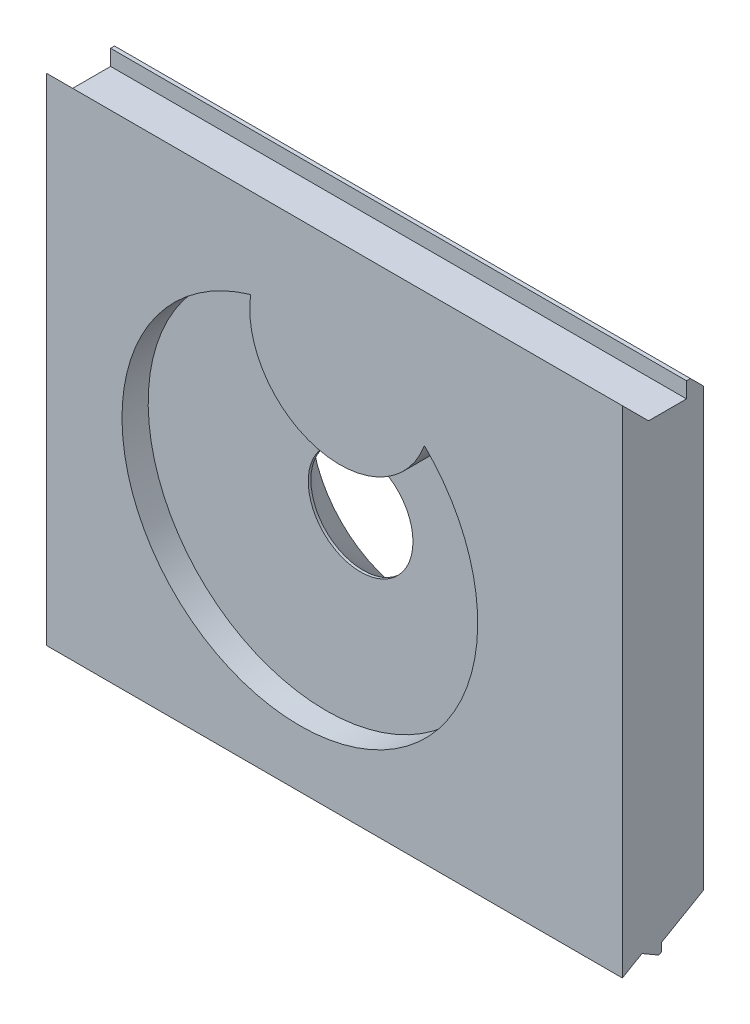
ISO-10303-21;
HEADER;
FILE_DESCRIPTION(('STEP AP214'),'2;1');
FILE_NAME('part.step','',(''),(''),'','','');
FILE_SCHEMA(('AUTOMOTIVE_DESIGN { 1 0 10303 214 1 1 1 1 }'));
ENDSEC;
DATA;
#1=APPLICATION_CONTEXT('core data for automotive mechanical design processes');
#2=APPLICATION_PROTOCOL_DEFINITION('international standard','automotive_design',2000,#1);
#3=PRODUCT_CONTEXT('',#1,'mechanical');
#4=PRODUCT('Part','Part','',(#3));
#5=PRODUCT_RELATED_PRODUCT_CATEGORY('part','',(#4));
#6=PRODUCT_DEFINITION_FORMATION('','',#4);
#7=PRODUCT_DEFINITION_CONTEXT('part definition',#1,'design');
#8=PRODUCT_DEFINITION('design','',#6,#7);
#9=PRODUCT_DEFINITION_SHAPE('','',#8);
#10=(LENGTH_UNIT() NAMED_UNIT(*) SI_UNIT(.MILLI.,.METRE.));
#11=(NAMED_UNIT(*) PLANE_ANGLE_UNIT() SI_UNIT($,.RADIAN.));
#12=(NAMED_UNIT(*) SI_UNIT($,.STERADIAN.) SOLID_ANGLE_UNIT());
#13=UNCERTAINTY_MEASURE_WITH_UNIT(LENGTH_MEASURE(1.E-05),#10,'distance_accuracy_value','');
#14=(GEOMETRIC_REPRESENTATION_CONTEXT(3) GLOBAL_UNCERTAINTY_ASSIGNED_CONTEXT((#13)) GLOBAL_UNIT_ASSIGNED_CONTEXT((#10,
#11,#12)) REPRESENTATION_CONTEXT('',''));
#15=CARTESIAN_POINT('',(0.,0.,0.));
#16=DIRECTION('',(0.,0.,1.));
#17=DIRECTION('',(1.,0.,0.));
#18=AXIS2_PLACEMENT_3D('',#15,#16,#17);
#19=CARTESIAN_POINT('',(22.,-18.3660254037844,0.));
#20=DIRECTION('',(0.,0.,1.));
#21=DIRECTION('',(0.,-1.,0.));
#22=AXIS2_PLACEMENT_3D('',#19,#20,#21);
#23=PLANE('',#22);
#24=DIRECTION('',(0.,1.,0.));
#25=VECTOR('',#24,1.);
#26=CARTESIAN_POINT('',(-22.,-18.3660254037844,0.));
#27=LINE('',#26,#25);
#28=CARTESIAN_POINT('',(-22.,-18.3660254037844,0.));
#29=VERTEX_POINT('',#28);
#30=CARTESIAN_POINT('',(-22.,19.5,0.));
#31=VERTEX_POINT('',#30);
#32=EDGE_CURVE('E247',#29,#31,#27,.T.);
#33=ORIENTED_EDGE('',*,*,#32,.F.);
#34=DIRECTION('',(-1.,0.,0.));
#35=VECTOR('',#34,1.);
#36=CARTESIAN_POINT('',(22.,-18.3660254037844,0.));
#37=LINE('',#36,#35);
#38=CARTESIAN_POINT('',(22.,-18.3660254037844,0.));
#39=VERTEX_POINT('',#38);
#40=EDGE_CURVE('E283',#39,#29,#37,.T.);
#41=ORIENTED_EDGE('',*,*,#40,.F.);
#42=DIRECTION('',(0.,-1.,0.));
#43=VECTOR('',#42,1.);
#44=CARTESIAN_POINT('',(22.,19.5,0.));
#45=LINE('',#44,#43);
#46=CARTESIAN_POINT('',(22.,19.5,0.));
#47=VERTEX_POINT('',#46);
#48=EDGE_CURVE('E219',#47,#39,#45,.T.);
#49=ORIENTED_EDGE('',*,*,#48,.F.);
#50=DIRECTION('',(-1.,0.,0.));
#51=VECTOR('',#50,1.);
#52=CARTESIAN_POINT('',(22.,19.5,0.));
#53=LINE('',#52,#51);
#54=EDGE_CURVE('E285',#47,#31,#53,.T.);
#55=ORIENTED_EDGE('',*,*,#54,.T.);
#56=EDGE_LOOP('',(#33,#41,#49,#55));
#57=FACE_BOUND('',#56,.T.);
#58=CARTESIAN_POINT('',(-2.64088104605542,-0.405297192010157,0.));
#59=DIRECTION('',(0.,0.,1.));
#60=DIRECTION('',(1.,0.,0.));
#61=AXIS2_PLACEMENT_3D('',#58,#59,#60);
#62=CIRCLE('',#61,13.5882922466304);
#63=CARTESIAN_POINT('',(-6.40316383933737,12.651766580646,0.));
#64=VERTEX_POINT('',#63);
#65=CARTESIAN_POINT('',(6.87547395210686,9.29422206044705,0.));
#66=VERTEX_POINT('',#65);
#67=EDGE_CURVE('E50',#64,#66,#62,.T.);
#68=ORIENTED_EDGE('',*,*,#67,.F.);
#69=CARTESIAN_POINT('',(0.417594285720029,11.6905621124277,0.));
#70=DIRECTION('',(0.,0.,-1.));
#71=DIRECTION('',(-1.,0.,0.));
#72=AXIS2_PLACEMENT_3D('',#69,#70,#71);
#73=CIRCLE('',#72,6.88815326704185);
#74=EDGE_CURVE('E172',#66,#64,#73,.T.);
#75=ORIENTED_EDGE('',*,*,#74,.F.);
#76=EDGE_LOOP('',(#68,#75));
#77=FACE_BOUND('',#76,.T.);
#78=ADVANCED_FACE('F34',(#57,#77),#23,.T.);
#79=CARTESIAN_POINT('',(0.,0.5,-6.2));
#80=DIRECTION('',(0.,0.,1.));
#81=DIRECTION('',(1.,0.,0.));
#82=AXIS2_PLACEMENT_3D('',#79,#80,#81);
#83=CYLINDRICAL_SURFACE('',#82,4.);
#84=CARTESIAN_POINT('',(0.,0.5,-2.19999999999999));
#85=DIRECTION('',(0.,0.,-1.));
#86=DIRECTION('',(-1.,0.,0.));
#87=AXIS2_PLACEMENT_3D('',#84,#85,#86);
#88=CIRCLE('',#87,4.);
#89=CARTESIAN_POINT('',(-4.,0.5,-2.19999999999999));
#90=VERTEX_POINT('',#89);
#91=EDGE_CURVE('E301',#90,#90,#88,.T.);
#92=ORIENTED_EDGE('',*,*,#91,.T.);
#93=EDGE_LOOP('',(#92));
#94=FACE_BOUND('',#93,.T.);
#95=CARTESIAN_POINT('',(0.,0.5,-2.));
#96=DIRECTION('',(0.,0.,1.));
#97=DIRECTION('',(1.,0.,0.));
#98=AXIS2_PLACEMENT_3D('',#95,#96,#97);
#99=CIRCLE('',#98,4.);
#100=CARTESIAN_POINT('',(4.,0.5,-2.));
#101=VERTEX_POINT('',#100);
#102=EDGE_CURVE('E38',#101,#101,#99,.F.);
#103=ORIENTED_EDGE('',*,*,#102,.F.);
#104=EDGE_LOOP('',(#103));
#105=FACE_BOUND('',#104,.T.);
#106=ADVANCED_FACE('F337',(#94,#105),#83,.F.);
#107=CARTESIAN_POINT('',(22.,17.5,-2.));
#108=DIRECTION('',(0.,-0.707106781186551,0.707106781186544));
#109=DIRECTION('',(0.,-0.707106781186544,-0.707106781186551));
#110=AXIS2_PLACEMENT_3D('',#107,#108,#109);
#111=PLANE('',#110);
#112=DIRECTION('',(0.,0.707106781186544,0.707106781186551));
#113=VECTOR('',#112,1.);
#114=CARTESIAN_POINT('',(-22.,17.5,-2.));
#115=LINE('',#114,#113);
#116=CARTESIAN_POINT('',(-22.,17.5,-2.));
#117=VERTEX_POINT('',#116);
#118=EDGE_CURVE('E215',#117,#31,#115,.T.);
#119=ORIENTED_EDGE('',*,*,#118,.T.);
#120=ORIENTED_EDGE('',*,*,#54,.F.);
#121=DIRECTION('',(0.,0.707106781186544,0.707106781186551));
#122=VECTOR('',#121,1.);
#123=CARTESIAN_POINT('',(22.,17.5,-2.));
#124=LINE('',#123,#122);
#125=CARTESIAN_POINT('',(22.,17.5,-2.));
#126=VERTEX_POINT('',#125);
#127=EDGE_CURVE('E216',#126,#47,#124,.T.);
#128=ORIENTED_EDGE('',*,*,#127,.F.);
#129=DIRECTION('',(-1.,0.,0.));
#130=VECTOR('',#129,1.);
#131=CARTESIAN_POINT('',(22.,17.5,-2.));
#132=LINE('',#131,#130);
#133=EDGE_CURVE('E244',#126,#117,#132,.T.);
#134=ORIENTED_EDGE('',*,*,#133,.T.);
#135=EDGE_LOOP('',(#119,#120,#128,#134));
#136=FACE_BOUND('',#135,.T.);
#137=ADVANCED_FACE('F340',(#136),#111,.F.);
#138=CARTESIAN_POINT('',(22.,-17.5,-1.5));
#139=DIRECTION('',(0.,-0.866025403784439,-0.5));
#140=DIRECTION('',(0.,0.5,-0.866025403784439));
#141=AXIS2_PLACEMENT_3D('',#138,#139,#140);
#142=PLANE('',#141);
#143=DIRECTION('',(0.,-0.5,0.866025403784438));
#144=VECTOR('',#143,1.);
#145=CARTESIAN_POINT('',(-22.,-17.5,-1.5));
#146=LINE('',#145,#144);
#147=CARTESIAN_POINT('',(-22.,-17.5,-1.5));
#148=VERTEX_POINT('',#147);
#149=EDGE_CURVE('E249',#148,#29,#146,.T.);
#150=ORIENTED_EDGE('',*,*,#149,.F.);
#151=DIRECTION('',(-1.,0.,0.));
#152=VECTOR('',#151,1.);
#153=CARTESIAN_POINT('',(22.,-17.5,-1.5));
#154=LINE('',#153,#152);
#155=CARTESIAN_POINT('',(22.,-17.5,-1.5));
#156=VERTEX_POINT('',#155);
#157=EDGE_CURVE('E280',#156,#148,#154,.T.);
#158=ORIENTED_EDGE('',*,*,#157,.F.);
#159=DIRECTION('',(0.,-0.5,0.866025403784438));
#160=VECTOR('',#159,1.);
#161=CARTESIAN_POINT('',(22.,-17.5,-1.5));
#162=LINE('',#161,#160);
#163=EDGE_CURVE('E222',#156,#39,#162,.T.);
#164=ORIENTED_EDGE('',*,*,#163,.T.);
#165=ORIENTED_EDGE('',*,*,#40,.T.);
#166=EDGE_LOOP('',(#150,#158,#164,#165));
#167=FACE_BOUND('',#166,.T.);
#168=ADVANCED_FACE('F378',(#167),#142,.T.);
#169=CARTESIAN_POINT('',(22.,-18.3660254037844,-3.));
#170=DIRECTION('',(0.,-0.866025403784438,0.5));
#171=DIRECTION('',(0.,-0.5,-0.866025403784439));
#172=AXIS2_PLACEMENT_3D('',#169,#170,#171);
#173=PLANE('',#172);
#174=DIRECTION('',(0.,0.5,0.866025403784439));
#175=VECTOR('',#174,1.);
#176=CARTESIAN_POINT('',(-22.,-18.3660254037844,-3.));
#177=LINE('',#176,#175);
#178=CARTESIAN_POINT('',(-22.,-18.1928203230276,-2.7));
#179=VERTEX_POINT('',#178);
#180=EDGE_CURVE('E252',#179,#148,#177,.T.);
#181=ORIENTED_EDGE('',*,*,#180,.F.);
#182=DIRECTION('',(-1.,0.,0.));
#183=VECTOR('',#182,1.);
#184=CARTESIAN_POINT('',(22.,-18.1928203230276,-2.7));
#185=LINE('',#184,#183);
#186=CARTESIAN_POINT('',(22.,-18.1928203230276,-2.7));
#187=VERTEX_POINT('',#186);
#188=EDGE_CURVE('E43',#179,#187,#185,.F.);
#189=ORIENTED_EDGE('',*,*,#188,.T.);
#190=DIRECTION('',(0.,0.5,0.866025403784439));
#191=VECTOR('',#190,1.);
#192=CARTESIAN_POINT('',(22.,-18.3660254037844,-3.));
#193=LINE('',#192,#191);
#194=EDGE_CURVE('E225',#187,#156,#193,.T.);
#195=ORIENTED_EDGE('',*,*,#194,.T.);
#196=ORIENTED_EDGE('',*,*,#157,.T.);
#197=EDGE_LOOP('',(#181,#189,#195,#196));
#198=FACE_BOUND('',#197,.T.);
#199=ADVANCED_FACE('F374',(#198),#173,.T.);
#200=CARTESIAN_POINT('',(22.,-17.5,-3.));
#201=DIRECTION('',(0.,0.,-1.));
#202=DIRECTION('',(-1.,0.,0.));
#203=AXIS2_PLACEMENT_3D('',#200,#201,#202);
#204=PLANE('',#203);
#205=DIRECTION('',(0.,-1.,0.));
#206=VECTOR('',#205,1.);
#207=CARTESIAN_POINT('',(22.,-17.5,-3.));
#208=LINE('',#207,#206);
#209=CARTESIAN_POINT('',(22.,-17.5,-3.));
#210=VERTEX_POINT('',#209);
#211=CARTESIAN_POINT('',(22.,-18.0196152422707,-3.));
#212=VERTEX_POINT('',#211);
#213=EDGE_CURVE('E227',#210,#212,#208,.T.);
#214=ORIENTED_EDGE('',*,*,#213,.T.);
#215=DIRECTION('',(-1.,0.,0.));
#216=VECTOR('',#215,1.);
#217=CARTESIAN_POINT('',(22.,-18.0196152422707,-3.));
#218=LINE('',#217,#216);
#219=CARTESIAN_POINT('',(-22.,-18.0196152422707,-3.));
#220=VERTEX_POINT('',#219);
#221=EDGE_CURVE('E418',#212,#220,#218,.T.);
#222=ORIENTED_EDGE('',*,*,#221,.T.);
#223=DIRECTION('',(0.,-1.,0.));
#224=VECTOR('',#223,1.);
#225=CARTESIAN_POINT('',(-22.,-17.5,-3.));
#226=LINE('',#225,#224);
#227=CARTESIAN_POINT('',(-22.,-17.5,-3.));
#228=VERTEX_POINT('',#227);
#229=EDGE_CURVE('E254',#228,#220,#226,.T.);
#230=ORIENTED_EDGE('',*,*,#229,.F.);
#231=DIRECTION('',(-1.,0.,0.));
#232=VECTOR('',#231,1.);
#233=CARTESIAN_POINT('',(22.,-17.5,-3.));
#234=LINE('',#233,#232);
#235=EDGE_CURVE('E278',#210,#228,#234,.T.);
#236=ORIENTED_EDGE('',*,*,#235,.F.);
#237=EDGE_LOOP('',(#214,#222,#230,#236));
#238=FACE_BOUND('',#237,.T.);
#239=ADVANCED_FACE('F370',(#238),#204,.T.);
#240=CARTESIAN_POINT('',(22.,-15.6524791385932,-6.2));
#241=DIRECTION('',(0.,-0.86602540378444,-0.499999999999998));
#242=DIRECTION('',(0.,0.499999999999998,-0.86602540378444));
#243=AXIS2_PLACEMENT_3D('',#240,#241,#242);
#244=PLANE('',#243);
#245=DIRECTION('',(0.,-0.499999999999998,0.86602540378444));
#246=VECTOR('',#245,1.);
#247=CARTESIAN_POINT('',(-22.,-15.6524791385932,-6.2));
#248=LINE('',#247,#246);
#249=CARTESIAN_POINT('',(-22.,-15.6524791385932,-6.2));
#250=VERTEX_POINT('',#249);
#251=EDGE_CURVE('E257',#250,#228,#248,.T.);
#252=ORIENTED_EDGE('',*,*,#251,.F.);
#253=DIRECTION('',(-1.,0.,0.));
#254=VECTOR('',#253,1.);
#255=CARTESIAN_POINT('',(22.,-15.6524791385932,-6.2));
#256=LINE('',#255,#254);
#257=CARTESIAN_POINT('',(22.,-15.6524791385932,-6.2));
#258=VERTEX_POINT('',#257);
#259=EDGE_CURVE('E275',#258,#250,#256,.T.);
#260=ORIENTED_EDGE('',*,*,#259,.F.);
#261=DIRECTION('',(0.,-0.499999999999998,0.86602540378444));
#262=VECTOR('',#261,1.);
#263=CARTESIAN_POINT('',(22.,-15.6524791385932,-6.2));
#264=LINE('',#263,#262);
#265=EDGE_CURVE('E230',#258,#210,#264,.T.);
#266=ORIENTED_EDGE('',*,*,#265,.T.);
#267=ORIENTED_EDGE('',*,*,#235,.T.);
#268=EDGE_LOOP('',(#252,#260,#266,#267));
#269=FACE_BOUND('',#268,.T.);
#270=ADVANCED_FACE('F366',(#269),#244,.T.);
#271=CARTESIAN_POINT('',(22.,18.7,-6.2));
#272=DIRECTION('',(0.,0.,-1.));
#273=DIRECTION('',(0.,1.,0.));
#274=AXIS2_PLACEMENT_3D('',#271,#272,#273);
#275=PLANE('',#274);
#276=CARTESIAN_POINT('',(10.5,12.5,-6.2));
#277=DIRECTION('',(0.,0.,-1.));
#278=DIRECTION('',(0.,1.,0.));
#279=AXIS2_PLACEMENT_3D('',#276,#277,#278);
#280=CIRCLE('',#279,3.15);
#281=CARTESIAN_POINT('',(10.5,15.65,-6.2));
#282=VERTEX_POINT('',#281);
#283=EDGE_CURVE('E180',#282,#282,#280,.T.);
#284=ORIENTED_EDGE('',*,*,#283,.F.);
#285=EDGE_LOOP('',(#284));
#286=FACE_BOUND('',#285,.T.);
#287=CARTESIAN_POINT('',(-10.5,12.5,-6.2));
#288=DIRECTION('',(0.,0.,-1.));
#289=DIRECTION('',(0.,1.,0.));
#290=AXIS2_PLACEMENT_3D('',#287,#288,#289);
#291=CIRCLE('',#290,3.15);
#292=CARTESIAN_POINT('',(-10.5,15.65,-6.2));
#293=VERTEX_POINT('',#292);
#294=EDGE_CURVE('E189',#293,#293,#291,.T.);
#295=ORIENTED_EDGE('',*,*,#294,.F.);
#296=EDGE_LOOP('',(#295));
#297=FACE_BOUND('',#296,.T.);
#298=CARTESIAN_POINT('',(-10.5,0.,-6.2));
#299=DIRECTION('',(0.,0.,-1.));
#300=DIRECTION('',(0.,1.,0.));
#301=AXIS2_PLACEMENT_3D('',#298,#299,#300);
#302=CIRCLE('',#301,3.15);
#303=CARTESIAN_POINT('',(-7.74084632051095,-1.51972726926973,-6.2));
#304=VERTEX_POINT('',#303);
#305=CARTESIAN_POINT('',(-7.89773965233971,1.77503269913401,-6.2));
#306=VERTEX_POINT('',#305);
#307=EDGE_CURVE('E198',#304,#306,#302,.T.);
#308=ORIENTED_EDGE('',*,*,#307,.F.);
#309=CARTESIAN_POINT('',(0.,0.5,-6.2));
#310=DIRECTION('',(0.,0.,-1.));
#311=DIRECTION('',(0.,1.,0.));
#312=AXIS2_PLACEMENT_3D('',#309,#310,#311);
#313=CIRCLE('',#312,7.99999999999999);
#314=CARTESIAN_POINT('',(7.74084632051096,-1.51972726926974,-6.2));
#315=VERTEX_POINT('',#314);
#316=EDGE_CURVE('E297',#304,#315,#313,.F.);
#317=ORIENTED_EDGE('',*,*,#316,.T.);
#318=CARTESIAN_POINT('',(10.5,0.,-6.2));
#319=DIRECTION('',(0.,0.,-1.));
#320=DIRECTION('',(0.,1.,0.));
#321=AXIS2_PLACEMENT_3D('',#318,#319,#320);
#322=CIRCLE('',#321,3.15);
#323=CARTESIAN_POINT('',(7.89773965233966,1.77503269913393,-6.2));
#324=VERTEX_POINT('',#323);
#325=EDGE_CURVE('E206',#324,#315,#322,.T.);
#326=ORIENTED_EDGE('',*,*,#325,.F.);
#327=EDGE_CURVE('E298',#324,#306,#313,.F.);
#328=ORIENTED_EDGE('',*,*,#327,.T.);
#329=EDGE_LOOP('',(#308,#317,#326,#328));
#330=FACE_BOUND('',#329,.T.);
#331=DIRECTION('',(0.,-1.,0.));
#332=VECTOR('',#331,1.);
#333=CARTESIAN_POINT('',(-22.,18.7,-6.2));
#334=LINE('',#333,#332);
#335=CARTESIAN_POINT('',(-22.,17.7,-6.2));
#336=VERTEX_POINT('',#335);
#337=EDGE_CURVE('E260',#336,#250,#334,.T.);
#338=ORIENTED_EDGE('',*,*,#337,.F.);
#339=DIRECTION('',(1.,0.,0.));
#340=VECTOR('',#339,1.);
#341=CARTESIAN_POINT('',(22.,17.7,-6.2));
#342=LINE('',#341,#340);
#343=CARTESIAN_POINT('',(22.,17.7,-6.2));
#344=VERTEX_POINT('',#343);
#345=EDGE_CURVE('E293',#336,#344,#342,.T.);
#346=ORIENTED_EDGE('',*,*,#345,.T.);
#347=DIRECTION('',(0.,-1.,0.));
#348=VECTOR('',#347,1.);
#349=CARTESIAN_POINT('',(22.,18.7,-6.2));
#350=LINE('',#349,#348);
#351=EDGE_CURVE('E233',#344,#258,#350,.T.);
#352=ORIENTED_EDGE('',*,*,#351,.T.);
#353=ORIENTED_EDGE('',*,*,#259,.T.);
#354=EDGE_LOOP('',(#338,#346,#352,#353));
#355=FACE_BOUND('',#354,.T.);
#356=ADVANCED_FACE('F362',(#286,#297,#330,#355),#275,.T.);
#357=CARTESIAN_POINT('',(22.,18.7,-4.9));
#358=DIRECTION('',(0.,1.,0.));
#359=DIRECTION('',(0.,0.,1.));
#360=AXIS2_PLACEMENT_3D('',#357,#358,#359);
#361=PLANE('',#360);
#362=DIRECTION('',(0.,0.,-1.));
#363=VECTOR('',#362,1.);
#364=CARTESIAN_POINT('',(22.,18.7,-4.9));
#365=LINE('',#364,#363);
#366=CARTESIAN_POINT('',(22.,18.7,-4.9));
#367=VERTEX_POINT('',#366);
#368=CARTESIAN_POINT('',(22.,18.7,-5.20000000000001));
#369=VERTEX_POINT('',#368);
#370=EDGE_CURVE('E235',#367,#369,#365,.T.);
#371=ORIENTED_EDGE('',*,*,#370,.T.);
#372=DIRECTION('',(-1.,0.,0.));
#373=VECTOR('',#372,1.);
#374=CARTESIAN_POINT('',(22.,18.7,-5.20000000000001));
#375=LINE('',#374,#373);
#376=CARTESIAN_POINT('',(-22.,18.7,-5.20000000000001));
#377=VERTEX_POINT('',#376);
#378=EDGE_CURVE('E288',#369,#377,#375,.T.);
#379=ORIENTED_EDGE('',*,*,#378,.T.);
#380=DIRECTION('',(0.,0.,-1.));
#381=VECTOR('',#380,1.);
#382=CARTESIAN_POINT('',(-22.,18.7,-4.9));
#383=LINE('',#382,#381);
#384=CARTESIAN_POINT('',(-22.,18.7,-4.9));
#385=VERTEX_POINT('',#384);
#386=EDGE_CURVE('E262',#385,#377,#383,.T.);
#387=ORIENTED_EDGE('',*,*,#386,.F.);
#388=DIRECTION('',(-1.,0.,0.));
#389=VECTOR('',#388,1.);
#390=CARTESIAN_POINT('',(22.,18.7,-4.9));
#391=LINE('',#390,#389);
#392=EDGE_CURVE('E273',#367,#385,#391,.T.);
#393=ORIENTED_EDGE('',*,*,#392,.F.);
#394=EDGE_LOOP('',(#371,#379,#387,#393));
#395=FACE_BOUND('',#394,.T.);
#396=ADVANCED_FACE('F358',(#395),#361,.T.);
#397=CARTESIAN_POINT('',(22.,17.5,-4.9));
#398=DIRECTION('',(0.,0.,1.));
#399=DIRECTION('',(1.,0.,0.));
#400=AXIS2_PLACEMENT_3D('',#397,#398,#399);
#401=PLANE('',#400);
#402=DIRECTION('',(0.,1.,0.));
#403=VECTOR('',#402,1.);
#404=CARTESIAN_POINT('',(-22.,17.5,-4.9));
#405=LINE('',#404,#403);
#406=CARTESIAN_POINT('',(-22.,17.5,-4.9));
#407=VERTEX_POINT('',#406);
#408=EDGE_CURVE('E265',#407,#385,#405,.T.);
#409=ORIENTED_EDGE('',*,*,#408,.F.);
#410=DIRECTION('',(-1.,0.,0.));
#411=VECTOR('',#410,1.);
#412=CARTESIAN_POINT('',(22.,17.5,-4.9));
#413=LINE('',#412,#411);
#414=CARTESIAN_POINT('',(22.,17.5,-4.9));
#415=VERTEX_POINT('',#414);
#416=EDGE_CURVE('E271',#415,#407,#413,.T.);
#417=ORIENTED_EDGE('',*,*,#416,.F.);
#418=DIRECTION('',(0.,1.,0.));
#419=VECTOR('',#418,1.);
#420=CARTESIAN_POINT('',(22.,17.5,-4.9));
#421=LINE('',#420,#419);
#422=EDGE_CURVE('E238',#415,#367,#421,.T.);
#423=ORIENTED_EDGE('',*,*,#422,.T.);
#424=ORIENTED_EDGE('',*,*,#392,.T.);
#425=EDGE_LOOP('',(#409,#417,#423,#424));
#426=FACE_BOUND('',#425,.T.);
#427=ADVANCED_FACE('F354',(#426),#401,.T.);
#428=CARTESIAN_POINT('',(22.,17.5,-2.));
#429=DIRECTION('',(0.,1.,0.));
#430=DIRECTION('',(0.,0.,1.));
#431=AXIS2_PLACEMENT_3D('',#428,#429,#430);
#432=PLANE('',#431);
#433=DIRECTION('',(0.,0.,-1.));
#434=VECTOR('',#433,1.);
#435=CARTESIAN_POINT('',(-22.,17.5,-2.));
#436=LINE('',#435,#434);
#437=EDGE_CURVE('E220',#117,#407,#436,.T.);
#438=ORIENTED_EDGE('',*,*,#437,.F.);
#439=ORIENTED_EDGE('',*,*,#133,.F.);
#440=DIRECTION('',(0.,0.,-1.));
#441=VECTOR('',#440,1.);
#442=CARTESIAN_POINT('',(22.,17.5,-2.));
#443=LINE('',#442,#441);
#444=EDGE_CURVE('E241',#126,#415,#443,.T.);
#445=ORIENTED_EDGE('',*,*,#444,.T.);
#446=ORIENTED_EDGE('',*,*,#416,.T.);
#447=EDGE_LOOP('',(#438,#439,#445,#446));
#448=FACE_BOUND('',#447,.T.);
#449=ADVANCED_FACE('F346',(#448),#432,.T.);
#450=CARTESIAN_POINT('',(22.,0.,0.));
#451=DIRECTION('',(1.,0.,0.));
#452=DIRECTION('',(0.,0.,-1.));
#453=AXIS2_PLACEMENT_3D('',#450,#451,#452);
#454=PLANE('',#453);
#455=ORIENTED_EDGE('',*,*,#194,.F.);
#456=CARTESIAN_POINT('',(22.,-18.0196152422707,-2.8));
#457=DIRECTION('',(1.,0.,0.));
#458=DIRECTION('',(0.,0.,-1.));
#459=AXIS2_PLACEMENT_3D('',#456,#457,#458);
#460=CIRCLE('',#459,0.2);
#461=EDGE_CURVE('E11',#187,#212,#460,.T.);
#462=ORIENTED_EDGE('',*,*,#461,.T.);
#463=ORIENTED_EDGE('',*,*,#213,.F.);
#464=ORIENTED_EDGE('',*,*,#265,.F.);
#465=ORIENTED_EDGE('',*,*,#351,.F.);
#466=DIRECTION('',(0.,-0.707106781186548,-0.707106781186548));
#467=VECTOR('',#466,1.);
#468=CARTESIAN_POINT('',(22.,11.95,-11.95));
#469=LINE('',#468,#467);
#470=EDGE_CURVE('E295',#344,#369,#469,.F.);
#471=ORIENTED_EDGE('',*,*,#470,.T.);
#472=ORIENTED_EDGE('',*,*,#370,.F.);
#473=ORIENTED_EDGE('',*,*,#422,.F.);
#474=ORIENTED_EDGE('',*,*,#444,.F.);
#475=ORIENTED_EDGE('',*,*,#127,.T.);
#476=ORIENTED_EDGE('',*,*,#48,.T.);
#477=ORIENTED_EDGE('',*,*,#163,.F.);
#478=EDGE_LOOP('',(#455,#462,#463,#464,#465,#471,#472,#473,#474,#475,#476,#477));
#479=FACE_BOUND('',#478,.T.);
#480=ADVANCED_FACE('F342',(#479),#454,.T.);
#481=CARTESIAN_POINT('',(-22.,0.,0.));
#482=DIRECTION('',(1.,0.,0.));
#483=DIRECTION('',(0.,0.,-1.));
#484=AXIS2_PLACEMENT_3D('',#481,#482,#483);
#485=PLANE('',#484);
#486=ORIENTED_EDGE('',*,*,#229,.T.);
#487=CARTESIAN_POINT('',(-22.,-18.0196152422707,-2.8));
#488=DIRECTION('',(1.,0.,0.));
#489=DIRECTION('',(0.,0.,-1.));
#490=AXIS2_PLACEMENT_3D('',#487,#488,#489);
#491=CIRCLE('',#490,0.2);
#492=EDGE_CURVE('E419',#220,#179,#491,.F.);
#493=ORIENTED_EDGE('',*,*,#492,.T.);
#494=ORIENTED_EDGE('',*,*,#180,.T.);
#495=ORIENTED_EDGE('',*,*,#149,.T.);
#496=ORIENTED_EDGE('',*,*,#32,.T.);
#497=ORIENTED_EDGE('',*,*,#118,.F.);
#498=ORIENTED_EDGE('',*,*,#437,.T.);
#499=ORIENTED_EDGE('',*,*,#408,.T.);
#500=ORIENTED_EDGE('',*,*,#386,.T.);
#501=DIRECTION('',(0.,0.707106781186548,0.707106781186548));
#502=VECTOR('',#501,1.);
#503=CARTESIAN_POINT('',(-22.,18.7,-5.20000000000001));
#504=LINE('',#503,#502);
#505=EDGE_CURVE('E291',#377,#336,#504,.F.);
#506=ORIENTED_EDGE('',*,*,#505,.T.);
#507=ORIENTED_EDGE('',*,*,#337,.T.);
#508=ORIENTED_EDGE('',*,*,#251,.T.);
#509=EDGE_LOOP('',(#486,#493,#494,#495,#496,#497,#498,#499,#500,#506,#507,#508));
#510=FACE_BOUND('',#509,.T.);
#511=ADVANCED_FACE('F345',(#510),#485,.F.);
#512=CARTESIAN_POINT('',(22.,18.7,-5.20000000000001));
#513=DIRECTION('',(0.,-0.707106781186547,0.707106781186547));
#514=DIRECTION('',(-1.,0.,0.));
#515=AXIS2_PLACEMENT_3D('',#512,#513,#514);
#516=PLANE('',#515);
#517=ORIENTED_EDGE('',*,*,#470,.F.);
#518=ORIENTED_EDGE('',*,*,#345,.F.);
#519=ORIENTED_EDGE('',*,*,#505,.F.);
#520=ORIENTED_EDGE('',*,*,#378,.F.);
#521=EDGE_LOOP('',(#517,#518,#519,#520));
#522=FACE_BOUND('',#521,.T.);
#523=ADVANCED_FACE('F350',(#522),#516,.F.);
#524=CARTESIAN_POINT('',(0.,0.5,-6.2));
#525=DIRECTION('',(0.,0.,-1.));
#526=DIRECTION('',(-1.,0.,0.));
#527=AXIS2_PLACEMENT_3D('',#524,#525,#526);
#528=CONICAL_SURFACE('',#527,7.99999999999999,0.785398163397447);
#529=CARTESIAN_POINT('',(-7.89785713244071,1.77555978125501,-6.2002));
#530=CARTESIAN_POINT('',(-7.87033802044135,1.65216770444711,-6.15334337363645));
#531=CARTESIAN_POINT('',(-7.84457704980333,1.52670184691131,-6.11050682460666));
#532=CARTESIAN_POINT('',(-7.79729297856006,1.27179180986981,-6.03441863300685));
#533=CARTESIAN_POINT('',(-7.77578051933959,1.14233855653153,-6.00119096393303));
#534=CARTESIAN_POINT('',(-7.73801309278128,0.881303473317379,-5.94633726541688));
#535=CARTESIAN_POINT('',(-7.7217168117681,0.749747498476312,-5.92461912853088));
#536=CARTESIAN_POINT('',(-7.69481020274037,0.484714587530091,-5.89369068743839));
#537=CARTESIAN_POINT('',(-7.68419369848469,0.351239900759328,-5.88446678009776));
#538=CARTESIAN_POINT('',(-7.66957473893352,0.0942988656136857,-5.87930625282721));
#539=CARTESIAN_POINT('',(-7.66511473709874,-0.0291222100532141,-5.88237440094961));
#540=CARTESIAN_POINT('',(-7.66126076468263,-0.275326570994339,-5.89941264218389));
#541=CARTESIAN_POINT('',(-7.66186875921078,-0.398109590396633,-5.91338696224703));
#542=CARTESIAN_POINT('',(-7.6678522185202,-0.641828557807157,-5.95146650997509));
#543=CARTESIAN_POINT('',(-7.67322332668279,-0.762766091004421,-5.9755624692067));
#544=CARTESIAN_POINT('',(-7.68823649094202,-1.00215888375374,-6.03274486530718));
#545=CARTESIAN_POINT('',(-7.6978769845329,-1.1206150348445,-6.06582801134284));
#546=CARTESIAN_POINT('',(-7.71404200970384,-1.2852588351688,-6.11779804525295));
#547=CARTESIAN_POINT('',(-7.7190242785025,-1.33264706075702,-6.13346978446512));
#548=CARTESIAN_POINT('',(-7.72955359010198,-1.42685632243888,-6.1659774963483));
#549=CARTESIAN_POINT('',(-7.7350995266708,-1.47367827515114,-6.18281116858083));
#550=CARTESIAN_POINT('',(-7.74091318430141,-1.52026312967167,-6.20020000000014));
#551=B_SPLINE_CURVE_WITH_KNOTS('',3,(#529,#530,#531,#532,#533,#534,#535,#536,#537,#538,#539,
#540,#541,#542,#543,#544,#545,#546,#547,#548,#549,#550),.UNSPECIFIED.,.F.,.F.,(4,2,2,2,2,2,2,2,
2,2,4),(0.,0.404611274506633,0.810223484988987,1.21253871506592,1.61441557006877,
1.98443873112822,2.3546053748939,2.72443379168961,3.09412697073081,3.24459394701574,
3.39477112502452),.UNSPECIFIED.);
#552=EDGE_CURVE('E311',#306,#304,#551,.T.);
#553=ORIENTED_EDGE('',*,*,#552,.F.);
#554=ORIENTED_EDGE('',*,*,#327,.F.);
#555=CARTESIAN_POINT('',(7.74091318430141,-1.52026312967167,-6.20020000000015));
#556=CARTESIAN_POINT('',(7.72524363214351,-1.39481444980865,-6.15334337363658));
#557=CARTESIAN_POINT('',(7.71152132204346,-1.26746843604722,-6.11050682460678));
#558=CARTESIAN_POINT('',(7.68867342658802,-1.00921878154385,-6.03441863300694));
#559=CARTESIAN_POINT('',(7.67955929668576,-0.878307119199712,-6.0011909639331));
#560=CARTESIAN_POINT('',(7.66676700213674,-0.614864430218513,-5.94633726541693));
#561=CARTESIAN_POINT('',(7.66304525394109,-0.482355215891296,-5.92461912853092));
#562=CARTESIAN_POINT('',(7.66144451703506,-0.215964812281529,-5.89369068743841));
#563=CARTESIAN_POINT('',(7.66355916629269,-0.0820852752727463,-5.88446678009777));
#564=CARTESIAN_POINT('',(7.67342156736419,0.175082262657671,-5.87930625282721));
#565=CARTESIAN_POINT('',(7.68070954105357,0.298368672998173,-5.8823744009496));
#566=CARTESIAN_POINT('',(7.70026799195049,0.54382520163071,-5.89941264218388));
#567=CARTESIAN_POINT('',(7.71254040011176,0.665994868523995,-5.91338696224702));
#568=CARTESIAN_POINT('',(7.74165560085245,0.908042471170251,-5.95146650997507));
#569=CARTESIAN_POINT('',(7.75849420715522,1.02792239891679,-5.97556246920667));
#570=CARTESIAN_POINT('',(7.79618716998221,1.2648053760906,-6.03274486530715));
#571=CARTESIAN_POINT('',(7.81704005578719,1.38180946149585,-6.06582801134282));
#572=CARTESIAN_POINT('',(7.84877682205151,1.54417222413271,-6.11779804525291));
#573=CARTESIAN_POINT('',(7.85823950021014,1.59087259510387,-6.13346978446507));
#574=CARTESIAN_POINT('',(7.87767317915673,1.683655047712,-6.1659774963482));
#575=CARTESIAN_POINT('',(7.8876431658178,1.72973814693708,-6.18281116858071));
#576=CARTESIAN_POINT('',(7.8978571324407,1.77555978125501,-6.2002));
#577=B_SPLINE_CURVE_WITH_KNOTS('',3,(#555,#556,#557,#558,#559,#560,#561,#562,#563,#564,#565,
#566,#567,#568,#569,#570,#571,#572,#573,#574,#575,#576),.UNSPECIFIED.,.F.,.F.,(4,2,2,2,2,2,2,2,
2,2,4),(0.,0.404611274506687,0.810223484989095,1.21253871506608,1.61441557006899,
1.98443873112846,2.35460537489418,2.72443379168992,3.09412697073115,3.24459394701592,
3.39477112502452),.UNSPECIFIED.);
#578=EDGE_CURVE('E304',#315,#324,#577,.T.);
#579=ORIENTED_EDGE('',*,*,#578,.F.);
#580=ORIENTED_EDGE('',*,*,#316,.F.);
#581=EDGE_LOOP('',(#553,#554,#579,#580));
#582=FACE_BOUND('',#581,.T.);
#583=ORIENTED_EDGE('',*,*,#91,.F.);
#584=EDGE_LOOP('',(#583));
#585=FACE_BOUND('',#584,.T.);
#586=ADVANCED_FACE('F318',(#582,#585),#528,.F.);
#587=CARTESIAN_POINT('',(10.5,0.,-3.2));
#588=DIRECTION('',(0.,0.,-1.));
#589=DIRECTION('',(0.,1.,0.));
#590=AXIS2_PLACEMENT_3D('',#587,#588,#589);
#591=CONICAL_SURFACE('',#590,0.0499999999999997,1.02974425867665);
#592=CARTESIAN_POINT('',(10.5,0.,-3.16995696904862));
#593=VERTEX_POINT('',#592);
#594=VERTEX_LOOP('',#593);
#595=FACE_BOUND('',#594,.T.);
#596=CARTESIAN_POINT('',(10.5,0.,-3.2));
#597=DIRECTION('',(0.,0.,-1.));
#598=DIRECTION('',(0.,1.,0.));
#599=AXIS2_PLACEMENT_3D('',#596,#597,#598);
#600=CIRCLE('',#599,0.0499999999999997);
#601=CARTESIAN_POINT('',(10.5,0.0500000000000029,-3.2));
#602=VERTEX_POINT('',#601);
#603=EDGE_CURVE('E212',#602,#602,#600,.T.);
#604=ORIENTED_EDGE('',*,*,#603,.T.);
#605=EDGE_LOOP('',(#604));
#606=FACE_BOUND('',#605,.T.);
#607=ADVANCED_FACE('F332',(#595,#606),#591,.F.);
#608=CARTESIAN_POINT('',(10.5,0.,-6.2));
#609=DIRECTION('',(0.,0.,-1.));
#610=DIRECTION('',(0.,1.,0.));
#611=AXIS2_PLACEMENT_3D('',#608,#609,#610);
#612=CYLINDRICAL_SURFACE('',#611,0.0499999999999997);
#613=ORIENTED_EDGE('',*,*,#603,.F.);
#614=EDGE_LOOP('',(#613));
#615=FACE_BOUND('',#614,.T.);
#616=CARTESIAN_POINT('',(10.5,0.,-3.1));
#617=DIRECTION('',(0.,0.,-1.));
#618=DIRECTION('',(0.,1.,0.));
#619=AXIS2_PLACEMENT_3D('',#616,#617,#618);
#620=CIRCLE('',#619,0.0499999999999997);
#621=CARTESIAN_POINT('',(10.5,0.0500000000000029,-3.1));
#622=VERTEX_POINT('',#621);
#623=EDGE_CURVE('E209',#622,#622,#620,.T.);
#624=ORIENTED_EDGE('',*,*,#623,.T.);
#625=EDGE_LOOP('',(#624));
#626=FACE_BOUND('',#625,.T.);
#627=ADVANCED_FACE('F327',(#615,#626),#612,.T.);
#628=CARTESIAN_POINT('',(10.5,0.,-6.2));
#629=DIRECTION('',(0.,0.,-1.));
#630=DIRECTION('',(0.,1.,0.));
#631=AXIS2_PLACEMENT_3D('',#628,#629,#630);
#632=CONICAL_SURFACE('',#631,3.15,0.785398163397448);
#633=ORIENTED_EDGE('',*,*,#578,.T.);
#634=ORIENTED_EDGE('',*,*,#325,.T.);
#635=EDGE_LOOP('',(#633,#634));
#636=FACE_BOUND('',#635,.T.);
#637=ORIENTED_EDGE('',*,*,#623,.F.);
#638=EDGE_LOOP('',(#637));
#639=FACE_BOUND('',#638,.T.);
#640=ADVANCED_FACE('F321',(#636,#639),#632,.F.);
#641=CARTESIAN_POINT('',(-10.5,0.,-3.2));
#642=DIRECTION('',(0.,0.,-1.));
#643=DIRECTION('',(0.,1.,0.));
#644=AXIS2_PLACEMENT_3D('',#641,#642,#643);
#645=CONICAL_SURFACE('',#644,0.0499999999999997,1.02974425867665);
#646=CARTESIAN_POINT('',(-10.5,0.,-3.16995696904862));
#647=VERTEX_POINT('',#646);
#648=VERTEX_LOOP('',#647);
#649=FACE_BOUND('',#648,.T.);
#650=CARTESIAN_POINT('',(-10.5,0.,-3.2));
#651=DIRECTION('',(0.,0.,-1.));
#652=DIRECTION('',(0.,1.,0.));
#653=AXIS2_PLACEMENT_3D('',#650,#651,#652);
#654=CIRCLE('',#653,0.0499999999999997);
#655=CARTESIAN_POINT('',(-10.5,0.0500000000000055,-3.2));
#656=VERTEX_POINT('',#655);
#657=EDGE_CURVE('E203',#656,#656,#654,.T.);
#658=ORIENTED_EDGE('',*,*,#657,.T.);
#659=EDGE_LOOP('',(#658));
#660=FACE_BOUND('',#659,.T.);
#661=ADVANCED_FACE('F326',(#649,#660),#645,.F.);
#662=CARTESIAN_POINT('',(-10.5,0.,-6.2));
#663=DIRECTION('',(0.,0.,-1.));
#664=DIRECTION('',(0.,1.,0.));
#665=AXIS2_PLACEMENT_3D('',#662,#663,#664);
#666=CYLINDRICAL_SURFACE('',#665,0.0499999999999997);
#667=ORIENTED_EDGE('',*,*,#657,.F.);
#668=EDGE_LOOP('',(#667));
#669=FACE_BOUND('',#668,.T.);
#670=CARTESIAN_POINT('',(-10.5,0.,-3.1));
#671=DIRECTION('',(0.,0.,-1.));
#672=DIRECTION('',(0.,1.,0.));
#673=AXIS2_PLACEMENT_3D('',#670,#671,#672);
#674=CIRCLE('',#673,0.0499999999999997);
#675=CARTESIAN_POINT('',(-10.5,0.0500000000000054,-3.1));
#676=VERTEX_POINT('',#675);
#677=EDGE_CURVE('E200',#676,#676,#674,.T.);
#678=ORIENTED_EDGE('',*,*,#677,.T.);
#679=EDGE_LOOP('',(#678));
#680=FACE_BOUND('',#679,.T.);
#681=ADVANCED_FACE('F477',(#669,#680),#666,.T.);
#682=CARTESIAN_POINT('',(-10.5,0.,-6.2));
#683=DIRECTION('',(0.,0.,-1.));
#684=DIRECTION('',(0.,1.,0.));
#685=AXIS2_PLACEMENT_3D('',#682,#683,#684);
#686=CONICAL_SURFACE('',#685,3.15,0.785398163397448);
#687=ORIENTED_EDGE('',*,*,#552,.T.);
#688=ORIENTED_EDGE('',*,*,#307,.T.);
#689=EDGE_LOOP('',(#687,#688));
#690=FACE_BOUND('',#689,.T.);
#691=ORIENTED_EDGE('',*,*,#677,.F.);
#692=EDGE_LOOP('',(#691));
#693=FACE_BOUND('',#692,.T.);
#694=ADVANCED_FACE('F426',(#690,#693),#686,.F.);
#695=CARTESIAN_POINT('',(-10.5,12.5,-3.2));
#696=DIRECTION('',(0.,0.,-1.));
#697=DIRECTION('',(0.,1.,0.));
#698=AXIS2_PLACEMENT_3D('',#695,#696,#697);
#699=CONICAL_SURFACE('',#698,0.0499999999999997,1.02974425867665);
#700=CARTESIAN_POINT('',(-10.5,12.5,-3.16995696904862));
#701=VERTEX_POINT('',#700);
#702=VERTEX_LOOP('',#701);
#703=FACE_BOUND('',#702,.T.);
#704=CARTESIAN_POINT('',(-10.5,12.5,-3.2));
#705=DIRECTION('',(0.,0.,-1.));
#706=DIRECTION('',(0.,1.,0.));
#707=AXIS2_PLACEMENT_3D('',#704,#705,#706);
#708=CIRCLE('',#707,0.0499999999999997);
#709=CARTESIAN_POINT('',(-10.5,12.55,-3.2));
#710=VERTEX_POINT('',#709);
#711=EDGE_CURVE('E195',#710,#710,#708,.T.);
#712=ORIENTED_EDGE('',*,*,#711,.T.);
#713=EDGE_LOOP('',(#712));
#714=FACE_BOUND('',#713,.T.);
#715=ADVANCED_FACE('F471',(#703,#714),#699,.F.);
#716=CARTESIAN_POINT('',(-10.5,12.5,-6.2));
#717=DIRECTION('',(0.,0.,-1.));
#718=DIRECTION('',(0.,1.,0.));
#719=AXIS2_PLACEMENT_3D('',#716,#717,#718);
#720=CYLINDRICAL_SURFACE('',#719,0.0499999999999997);
#721=ORIENTED_EDGE('',*,*,#711,.F.);
#722=EDGE_LOOP('',(#721));
#723=FACE_BOUND('',#722,.T.);
#724=CARTESIAN_POINT('',(-10.5,12.5,-3.1));
#725=DIRECTION('',(0.,0.,-1.));
#726=DIRECTION('',(0.,1.,0.));
#727=AXIS2_PLACEMENT_3D('',#724,#725,#726);
#728=CIRCLE('',#727,0.0499999999999997);
#729=CARTESIAN_POINT('',(-10.5,12.55,-3.1));
#730=VERTEX_POINT('',#729);
#731=EDGE_CURVE('E192',#730,#730,#728,.T.);
#732=ORIENTED_EDGE('',*,*,#731,.T.);
#733=EDGE_LOOP('',(#732));
#734=FACE_BOUND('',#733,.T.);
#735=ADVANCED_FACE('F467',(#723,#734),#720,.T.);
#736=CARTESIAN_POINT('',(-10.5,12.5,-6.2));
#737=DIRECTION('',(0.,0.,-1.));
#738=DIRECTION('',(0.,1.,0.));
#739=AXIS2_PLACEMENT_3D('',#736,#737,#738);
#740=CONICAL_SURFACE('',#739,3.15,0.785398163397448);
#741=CARTESIAN_POINT('',(-10.5,12.55,-3.1));
#742=CARTESIAN_POINT('',(-10.5,12.5822916666667,-3.13229166666667));
#743=CARTESIAN_POINT('',(-10.5,12.6145833333333,-3.16458333333333));
#744=CARTESIAN_POINT('',(-10.5,12.6791666666667,-3.22916666666667));
#745=CARTESIAN_POINT('',(-10.5,12.7114583333333,-3.26145833333333));
#746=CARTESIAN_POINT('',(-10.5,12.7760416666667,-3.32604166666667));
#747=CARTESIAN_POINT('',(-10.5,12.8083333333333,-3.35833333333333));
#748=CARTESIAN_POINT('',(-10.5,12.8729166666667,-3.42291666666667));
#749=CARTESIAN_POINT('',(-10.5,12.9052083333333,-3.45520833333333));
#750=CARTESIAN_POINT('',(-10.5,12.9697916666667,-3.51979166666667));
#751=CARTESIAN_POINT('',(-10.5,13.0020833333333,-3.55208333333333));
#752=CARTESIAN_POINT('',(-10.5,13.0666666666667,-3.61666666666667));
#753=CARTESIAN_POINT('',(-10.5,13.0989583333333,-3.64895833333333));
#754=CARTESIAN_POINT('',(-10.5,13.1635416666667,-3.71354166666667));
#755=CARTESIAN_POINT('',(-10.5,13.1958333333333,-3.74583333333333));
#756=CARTESIAN_POINT('',(-10.5,13.2604166666667,-3.81041666666667));
#757=CARTESIAN_POINT('',(-10.5,13.2927083333333,-3.84270833333333));
#758=CARTESIAN_POINT('',(-10.5,13.3572916666667,-3.90729166666667));
#759=CARTESIAN_POINT('',(-10.5,13.3895833333333,-3.93958333333333));
#760=CARTESIAN_POINT('',(-10.5,13.4541666666667,-4.00416666666667));
#761=CARTESIAN_POINT('',(-10.5,13.4864583333333,-4.03645833333333));
#762=CARTESIAN_POINT('',(-10.5,13.5510416666667,-4.10104166666667));
#763=CARTESIAN_POINT('',(-10.5,13.5833333333333,-4.13333333333333));
#764=CARTESIAN_POINT('',(-10.5,13.6479166666667,-4.19791666666667));
#765=CARTESIAN_POINT('',(-10.5,13.6802083333333,-4.23020833333333));
#766=CARTESIAN_POINT('',(-10.5,13.7447916666667,-4.29479166666667));
#767=CARTESIAN_POINT('',(-10.5,13.7770833333333,-4.32708333333333));
#768=CARTESIAN_POINT('',(-10.5,13.8416666666667,-4.39166666666667));
#769=CARTESIAN_POINT('',(-10.5,13.8739583333333,-4.42395833333333));
#770=CARTESIAN_POINT('',(-10.5,13.9385416666667,-4.48854166666667));
#771=CARTESIAN_POINT('',(-10.5,13.9708333333333,-4.52083333333333));
#772=CARTESIAN_POINT('',(-10.5,14.0354166666667,-4.58541666666667));
#773=CARTESIAN_POINT('',(-10.5,14.0677083333333,-4.61770833333333));
#774=CARTESIAN_POINT('',(-10.5,14.1322916666667,-4.68229166666667));
#775=CARTESIAN_POINT('',(-10.5,14.1645833333333,-4.71458333333333));
#776=CARTESIAN_POINT('',(-10.5,14.2291666666667,-4.77916666666667));
#777=CARTESIAN_POINT('',(-10.5,14.2614583333333,-4.81145833333333));
#778=CARTESIAN_POINT('',(-10.5,14.3260416666667,-4.87604166666667));
#779=CARTESIAN_POINT('',(-10.5,14.3583333333333,-4.90833333333333));
#780=CARTESIAN_POINT('',(-10.5,14.4229166666667,-4.97291666666667));
#781=CARTESIAN_POINT('',(-10.5,14.4552083333333,-5.00520833333333));
#782=CARTESIAN_POINT('',(-10.5,14.5197916666667,-5.06979166666667));
#783=CARTESIAN_POINT('',(-10.5,14.5520833333333,-5.10208333333333));
#784=CARTESIAN_POINT('',(-10.5,14.6166666666667,-5.16666666666667));
#785=CARTESIAN_POINT('',(-10.5,14.6489583333333,-5.19895833333333));
#786=CARTESIAN_POINT('',(-10.5,14.7135416666667,-5.26354166666667));
#787=CARTESIAN_POINT('',(-10.5,14.7458333333333,-5.29583333333333));
#788=CARTESIAN_POINT('',(-10.5,14.8104166666667,-5.36041666666667));
#789=CARTESIAN_POINT('',(-10.5,14.8427083333333,-5.39270833333333));
#790=CARTESIAN_POINT('',(-10.5,14.9072916666667,-5.45729166666667));
#791=CARTESIAN_POINT('',(-10.5,14.9395833333333,-5.48958333333333));
#792=CARTESIAN_POINT('',(-10.5,15.0041666666667,-5.55416666666667));
#793=CARTESIAN_POINT('',(-10.5,15.0364583333333,-5.58645833333333));
#794=CARTESIAN_POINT('',(-10.5,15.1010416666667,-5.65104166666667));
#795=CARTESIAN_POINT('',(-10.5,15.1333333333333,-5.68333333333333));
#796=CARTESIAN_POINT('',(-10.5,15.1979166666667,-5.74791666666667));
#797=CARTESIAN_POINT('',(-10.5,15.2302083333333,-5.78020833333333));
#798=CARTESIAN_POINT('',(-10.5,15.2947916666667,-5.84479166666667));
#799=CARTESIAN_POINT('',(-10.5,15.3270833333333,-5.87708333333333));
#800=CARTESIAN_POINT('',(-10.5,15.3916666666667,-5.94166666666667));
#801=CARTESIAN_POINT('',(-10.5,15.4239583333333,-5.97395833333333));
#802=CARTESIAN_POINT('',(-10.5,15.4885416666667,-6.03854166666667));
#803=CARTESIAN_POINT('',(-10.5,15.5208333333333,-6.07083333333333));
#804=CARTESIAN_POINT('',(-10.5,15.5854166666667,-6.13541666666667));
#805=CARTESIAN_POINT('',(-10.5,15.6177083333333,-6.16770833333333));
#806=CARTESIAN_POINT('',(-10.5,15.65,-6.2));
#807=B_SPLINE_CURVE_WITH_KNOTS('',3,(#741,#742,#743,#744,#745,#746,#747,#748,#749,#750,#751,
#752,#753,#754,#755,#756,#757,#758,#759,#760,#761,#762,#763,#764,#765,#766,#767,#768,#769,#770,
#771,#772,#773,#774,#775,#776,#777,#778,#779,#780,#781,#782,#783,#784,#785,#786,#787,#788,#789,
#790,#791,#792,#793,#794,#795,#796,#797,#798,#799,#800,#801,#802,#803,#804,#805,#806),
.UNSPECIFIED.,.F.,.F.,(4,2,2,2,2,2,2,2,2,2,2,2,2,2,2,2,2,2,2,2,2,2,2,2,2,2,2,2,2,2,2,2,4),(0.,
0.137001938854894,0.274003877709787,0.411005816564682,0.548007755419575,0.685009694274468,
0.822011633129362,0.959013571984255,1.09601551083915,1.23301744969404,1.37001938854894,
1.50702132740383,1.64402326625872,1.78102520511362,1.91802714396851,2.0550290828234,
2.1920310216783,2.32903296053319,2.46603489938808,2.60303683824298,2.74003877709787,
2.87704071595277,3.01404265480766,3.15104459366255,3.28804653251745,3.42504847137234,
3.56205041022723,3.69905234908213,3.83605428793702,3.97305622679191,4.11005816564681,
4.2470601045017,4.3840620433566),.UNSPECIFIED.);
#808=EDGE_CURVE('BSEAM463',#730,#293,#807,.T.);
#809=ORIENTED_EDGE('',*,*,#731,.F.);
#810=ORIENTED_EDGE('',*,*,#294,.T.);
#811=ORIENTED_EDGE('',*,*,#808,.T.);
#812=ORIENTED_EDGE('',*,*,#808,.F.);
#813=EDGE_LOOP('',(#809,#811,#810,#812));
#814=FACE_BOUND('',#813,.T.);
#815=ADVANCED_FACE('F463',(#814),#740,.F.);
#816=CARTESIAN_POINT('',(10.5,12.5,-3.2));
#817=DIRECTION('',(0.,0.,-1.));
#818=DIRECTION('',(0.,1.,0.));
#819=AXIS2_PLACEMENT_3D('',#816,#817,#818);
#820=CONICAL_SURFACE('',#819,0.0499999999999997,1.02974425867665);
#821=CARTESIAN_POINT('',(10.5,12.5,-3.16995696904862));
#822=VERTEX_POINT('',#821);
#823=VERTEX_LOOP('',#822);
#824=FACE_BOUND('',#823,.T.);
#825=CARTESIAN_POINT('',(10.5,12.5,-3.2));
#826=DIRECTION('',(0.,0.,-1.));
#827=DIRECTION('',(0.,1.,0.));
#828=AXIS2_PLACEMENT_3D('',#825,#826,#827);
#829=CIRCLE('',#828,0.0499999999999997);
#830=CARTESIAN_POINT('',(10.5,12.55,-3.2));
#831=VERTEX_POINT('',#830);
#832=EDGE_CURVE('E186',#831,#831,#829,.T.);
#833=ORIENTED_EDGE('',*,*,#832,.T.);
#834=EDGE_LOOP('',(#833));
#835=FACE_BOUND('',#834,.T.);
#836=ADVANCED_FACE('F459',(#824,#835),#820,.F.);
#837=CARTESIAN_POINT('',(10.5,12.5,-6.2));
#838=DIRECTION('',(0.,0.,-1.));
#839=DIRECTION('',(0.,1.,0.));
#840=AXIS2_PLACEMENT_3D('',#837,#838,#839);
#841=CYLINDRICAL_SURFACE('',#840,0.0499999999999997);
#842=ORIENTED_EDGE('',*,*,#832,.F.);
#843=EDGE_LOOP('',(#842));
#844=FACE_BOUND('',#843,.T.);
#845=CARTESIAN_POINT('',(10.5,12.5,-3.1));
#846=DIRECTION('',(0.,0.,-1.));
#847=DIRECTION('',(0.,1.,0.));
#848=AXIS2_PLACEMENT_3D('',#845,#846,#847);
#849=CIRCLE('',#848,0.0499999999999997);
#850=CARTESIAN_POINT('',(10.5,12.55,-3.1));
#851=VERTEX_POINT('',#850);
#852=EDGE_CURVE('E183',#851,#851,#849,.T.);
#853=ORIENTED_EDGE('',*,*,#852,.T.);
#854=EDGE_LOOP('',(#853));
#855=FACE_BOUND('',#854,.T.);
#856=ADVANCED_FACE('F455',(#844,#855),#841,.T.);
#857=CARTESIAN_POINT('',(10.5,12.5,-6.2));
#858=DIRECTION('',(0.,0.,-1.));
#859=DIRECTION('',(0.,1.,0.));
#860=AXIS2_PLACEMENT_3D('',#857,#858,#859);
#861=CONICAL_SURFACE('',#860,3.15,0.785398163397448);
#862=CARTESIAN_POINT('',(10.5,12.55,-3.1));
#863=CARTESIAN_POINT('',(10.5,12.5822916666667,-3.13229166666667));
#864=CARTESIAN_POINT('',(10.5,12.6145833333333,-3.16458333333333));
#865=CARTESIAN_POINT('',(10.5,12.6791666666667,-3.22916666666667));
#866=CARTESIAN_POINT('',(10.5,12.7114583333333,-3.26145833333333));
#867=CARTESIAN_POINT('',(10.5,12.7760416666667,-3.32604166666667));
#868=CARTESIAN_POINT('',(10.5,12.8083333333333,-3.35833333333333));
#869=CARTESIAN_POINT('',(10.5,12.8729166666667,-3.42291666666667));
#870=CARTESIAN_POINT('',(10.5,12.9052083333333,-3.45520833333333));
#871=CARTESIAN_POINT('',(10.5,12.9697916666667,-3.51979166666667));
#872=CARTESIAN_POINT('',(10.5,13.0020833333333,-3.55208333333333));
#873=CARTESIAN_POINT('',(10.5,13.0666666666667,-3.61666666666667));
#874=CARTESIAN_POINT('',(10.5,13.0989583333333,-3.64895833333333));
#875=CARTESIAN_POINT('',(10.5,13.1635416666667,-3.71354166666667));
#876=CARTESIAN_POINT('',(10.5,13.1958333333333,-3.74583333333333));
#877=CARTESIAN_POINT('',(10.5,13.2604166666667,-3.81041666666667));
#878=CARTESIAN_POINT('',(10.5,13.2927083333333,-3.84270833333333));
#879=CARTESIAN_POINT('',(10.5,13.3572916666667,-3.90729166666667));
#880=CARTESIAN_POINT('',(10.5,13.3895833333333,-3.93958333333333));
#881=CARTESIAN_POINT('',(10.5,13.4541666666667,-4.00416666666667));
#882=CARTESIAN_POINT('',(10.5,13.4864583333333,-4.03645833333333));
#883=CARTESIAN_POINT('',(10.5,13.5510416666667,-4.10104166666667));
#884=CARTESIAN_POINT('',(10.5,13.5833333333333,-4.13333333333333));
#885=CARTESIAN_POINT('',(10.5,13.6479166666667,-4.19791666666667));
#886=CARTESIAN_POINT('',(10.5,13.6802083333333,-4.23020833333333));
#887=CARTESIAN_POINT('',(10.5,13.7447916666667,-4.29479166666667));
#888=CARTESIAN_POINT('',(10.5,13.7770833333333,-4.32708333333333));
#889=CARTESIAN_POINT('',(10.5,13.8416666666667,-4.39166666666667));
#890=CARTESIAN_POINT('',(10.5,13.8739583333333,-4.42395833333333));
#891=CARTESIAN_POINT('',(10.5,13.9385416666667,-4.48854166666667));
#892=CARTESIAN_POINT('',(10.5,13.9708333333333,-4.52083333333333));
#893=CARTESIAN_POINT('',(10.5,14.0354166666667,-4.58541666666667));
#894=CARTESIAN_POINT('',(10.5,14.0677083333333,-4.61770833333333));
#895=CARTESIAN_POINT('',(10.5,14.1322916666667,-4.68229166666667));
#896=CARTESIAN_POINT('',(10.5,14.1645833333333,-4.71458333333333));
#897=CARTESIAN_POINT('',(10.5,14.2291666666667,-4.77916666666667));
#898=CARTESIAN_POINT('',(10.5,14.2614583333333,-4.81145833333333));
#899=CARTESIAN_POINT('',(10.5,14.3260416666667,-4.87604166666667));
#900=CARTESIAN_POINT('',(10.5,14.3583333333333,-4.90833333333333));
#901=CARTESIAN_POINT('',(10.5,14.4229166666667,-4.97291666666667));
#902=CARTESIAN_POINT('',(10.5,14.4552083333333,-5.00520833333333));
#903=CARTESIAN_POINT('',(10.5,14.5197916666667,-5.06979166666667));
#904=CARTESIAN_POINT('',(10.5,14.5520833333333,-5.10208333333333));
#905=CARTESIAN_POINT('',(10.5,14.6166666666667,-5.16666666666667));
#906=CARTESIAN_POINT('',(10.5,14.6489583333333,-5.19895833333333));
#907=CARTESIAN_POINT('',(10.5,14.7135416666667,-5.26354166666667));
#908=CARTESIAN_POINT('',(10.5,14.7458333333333,-5.29583333333333));
#909=CARTESIAN_POINT('',(10.5,14.8104166666667,-5.36041666666667));
#910=CARTESIAN_POINT('',(10.5,14.8427083333333,-5.39270833333333));
#911=CARTESIAN_POINT('',(10.5,14.9072916666667,-5.45729166666667));
#912=CARTESIAN_POINT('',(10.5,14.9395833333333,-5.48958333333333));
#913=CARTESIAN_POINT('',(10.5,15.0041666666667,-5.55416666666667));
#914=CARTESIAN_POINT('',(10.5,15.0364583333333,-5.58645833333333));
#915=CARTESIAN_POINT('',(10.5,15.1010416666667,-5.65104166666667));
#916=CARTESIAN_POINT('',(10.5,15.1333333333333,-5.68333333333333));
#917=CARTESIAN_POINT('',(10.5,15.1979166666667,-5.74791666666667));
#918=CARTESIAN_POINT('',(10.5,15.2302083333333,-5.78020833333333));
#919=CARTESIAN_POINT('',(10.5,15.2947916666667,-5.84479166666667));
#920=CARTESIAN_POINT('',(10.5,15.3270833333333,-5.87708333333333));
#921=CARTESIAN_POINT('',(10.5,15.3916666666667,-5.94166666666667));
#922=CARTESIAN_POINT('',(10.5,15.4239583333333,-5.97395833333333));
#923=CARTESIAN_POINT('',(10.5,15.4885416666667,-6.03854166666667));
#924=CARTESIAN_POINT('',(10.5,15.5208333333333,-6.07083333333333));
#925=CARTESIAN_POINT('',(10.5,15.5854166666667,-6.13541666666667));
#926=CARTESIAN_POINT('',(10.5,15.6177083333333,-6.16770833333333));
#927=CARTESIAN_POINT('',(10.5,15.65,-6.2));
#928=B_SPLINE_CURVE_WITH_KNOTS('',3,(#862,#863,#864,#865,#866,#867,#868,#869,#870,#871,#872,
#873,#874,#875,#876,#877,#878,#879,#880,#881,#882,#883,#884,#885,#886,#887,#888,#889,#890,#891,
#892,#893,#894,#895,#896,#897,#898,#899,#900,#901,#902,#903,#904,#905,#906,#907,#908,#909,#910,
#911,#912,#913,#914,#915,#916,#917,#918,#919,#920,#921,#922,#923,#924,#925,#926,#927),
.UNSPECIFIED.,.F.,.F.,(4,2,2,2,2,2,2,2,2,2,2,2,2,2,2,2,2,2,2,2,2,2,2,2,2,2,2,2,2,2,2,2,4),(0.,
0.137001938854894,0.274003877709787,0.411005816564682,0.548007755419575,0.685009694274468,
0.822011633129362,0.959013571984255,1.09601551083915,1.23301744969404,1.37001938854894,
1.50702132740383,1.64402326625872,1.78102520511362,1.91802714396851,2.0550290828234,
2.1920310216783,2.32903296053319,2.46603489938808,2.60303683824298,2.74003877709787,
2.87704071595277,3.01404265480766,3.15104459366255,3.28804653251745,3.42504847137234,
3.56205041022723,3.69905234908213,3.83605428793702,3.97305622679191,4.11005816564681,
4.2470601045017,4.3840620433566),.UNSPECIFIED.);
#929=EDGE_CURVE('BSEAM449',#851,#282,#928,.T.);
#930=ORIENTED_EDGE('',*,*,#852,.F.);
#931=ORIENTED_EDGE('',*,*,#283,.T.);
#932=ORIENTED_EDGE('',*,*,#929,.T.);
#933=ORIENTED_EDGE('',*,*,#929,.F.);
#934=EDGE_LOOP('',(#930,#932,#931,#933));
#935=FACE_BOUND('',#934,.T.);
#936=ADVANCED_FACE('F449',(#935),#861,.F.);
#937=CARTESIAN_POINT('',(22.,-18.0196152422707,-2.8));
#938=DIRECTION('',(-1.,0.,0.));
#939=DIRECTION('',(0.,0.,1.));
#940=AXIS2_PLACEMENT_3D('',#937,#938,#939);
#941=CYLINDRICAL_SURFACE('',#940,0.2);
#942=ORIENTED_EDGE('',*,*,#461,.F.);
#943=ORIENTED_EDGE('',*,*,#188,.F.);
#944=ORIENTED_EDGE('',*,*,#492,.F.);
#945=ORIENTED_EDGE('',*,*,#221,.F.);
#946=EDGE_LOOP('',(#942,#943,#944,#945));
#947=FACE_BOUND('',#946,.T.);
#948=ADVANCED_FACE('F36',(#947),#941,.T.);
#949=CARTESIAN_POINT('',(-1.11164338016769,5.6426324602088,-2.));
#950=DIRECTION('',(0.,0.,1.));
#951=DIRECTION('',(1.,0.,0.));
#952=AXIS2_PLACEMENT_3D('',#949,#950,#951);
#953=PLANE('',#952);
#954=CARTESIAN_POINT('',(-2.64088104605542,-0.405297192010157,-2.));
#955=DIRECTION('',(0.,0.,1.));
#956=DIRECTION('',(1.,0.,0.));
#957=AXIS2_PLACEMENT_3D('',#954,#955,#956);
#958=CIRCLE('',#957,13.5882922466304);
#959=CARTESIAN_POINT('',(-6.40316383933737,12.651766580646,-2.));
#960=VERTEX_POINT('',#959);
#961=CARTESIAN_POINT('',(6.87547395210686,9.29422206044705,-2.));
#962=VERTEX_POINT('',#961);
#963=EDGE_CURVE('E160',#960,#962,#958,.T.);
#964=ORIENTED_EDGE('',*,*,#963,.T.);
#965=CARTESIAN_POINT('',(0.417594285720029,11.6905621124277,-2.));
#966=DIRECTION('',(0.,0.,-1.));
#967=DIRECTION('',(-1.,0.,0.));
#968=AXIS2_PLACEMENT_3D('',#965,#966,#967);
#969=CIRCLE('',#968,6.88815326704185);
#970=EDGE_CURVE('E167',#962,#960,#969,.T.);
#971=ORIENTED_EDGE('',*,*,#970,.T.);
#972=EDGE_LOOP('',(#964,#971));
#973=FACE_BOUND('',#972,.T.);
#974=ORIENTED_EDGE('',*,*,#102,.T.);
#975=EDGE_LOOP('',(#974));
#976=FACE_BOUND('',#975,.T.);
#977=ADVANCED_FACE('F170',(#973,#976),#953,.T.);
#978=CARTESIAN_POINT('',(-2.64088104605542,-0.405297192010157,-2.));
#979=DIRECTION('',(0.,0.,1.));
#980=DIRECTION('',(1.,0.,0.));
#981=AXIS2_PLACEMENT_3D('',#978,#979,#980);
#982=CYLINDRICAL_SURFACE('',#981,13.5882922466304);
#983=ORIENTED_EDGE('',*,*,#67,.T.);
#984=DIRECTION('',(0.,0.,1.));
#985=VECTOR('',#984,1.);
#986=CARTESIAN_POINT('',(6.87547395210686,9.29422206044705,-2.));
#987=LINE('',#986,#985);
#988=EDGE_CURVE('E157',#962,#66,#987,.T.);
#989=ORIENTED_EDGE('',*,*,#988,.F.);
#990=ORIENTED_EDGE('',*,*,#963,.F.);
#991=DIRECTION('',(0.,0.,1.));
#992=VECTOR('',#991,1.);
#993=CARTESIAN_POINT('',(-6.40316383933737,12.651766580646,-2.));
#994=LINE('',#993,#992);
#995=EDGE_CURVE('E166',#960,#64,#994,.T.);
#996=ORIENTED_EDGE('',*,*,#995,.T.);
#997=EDGE_LOOP('',(#983,#989,#990,#996));
#998=FACE_BOUND('',#997,.T.);
#999=ADVANCED_FACE('F159',(#998),#982,.F.);
#1000=CARTESIAN_POINT('',(0.417594285720029,11.6905621124277,-2.));
#1001=DIRECTION('',(0.,0.,1.));
#1002=DIRECTION('',(1.,0.,0.));
#1003=AXIS2_PLACEMENT_3D('',#1000,#1001,#1002);
#1004=CYLINDRICAL_SURFACE('',#1003,6.88815326704185);
#1005=ORIENTED_EDGE('',*,*,#74,.T.);
#1006=ORIENTED_EDGE('',*,*,#995,.F.);
#1007=ORIENTED_EDGE('',*,*,#970,.F.);
#1008=ORIENTED_EDGE('',*,*,#988,.T.);
#1009=EDGE_LOOP('',(#1005,#1006,#1007,#1008));
#1010=FACE_BOUND('',#1009,.T.);
#1011=ADVANCED_FACE('F174',(#1010),#1004,.T.);
#1012=CLOSED_SHELL('',(#78,#106,#137,#168,#199,#239,#270,#356,#396,#427,#449,#480,#511,#523,
#586,#607,#627,#640,#661,#681,#694,#715,#735,#815,#836,#856,#936,#948,#977,#999,#1011));
#1013=MANIFOLD_SOLID_BREP('B2',#1012);
#1014=ADVANCED_BREP_SHAPE_REPRESENTATION('',(#18,#1013),#14);
#1015=SHAPE_DEFINITION_REPRESENTATION(#9,#1014);
ENDSEC;
END-ISO-10303-21;
